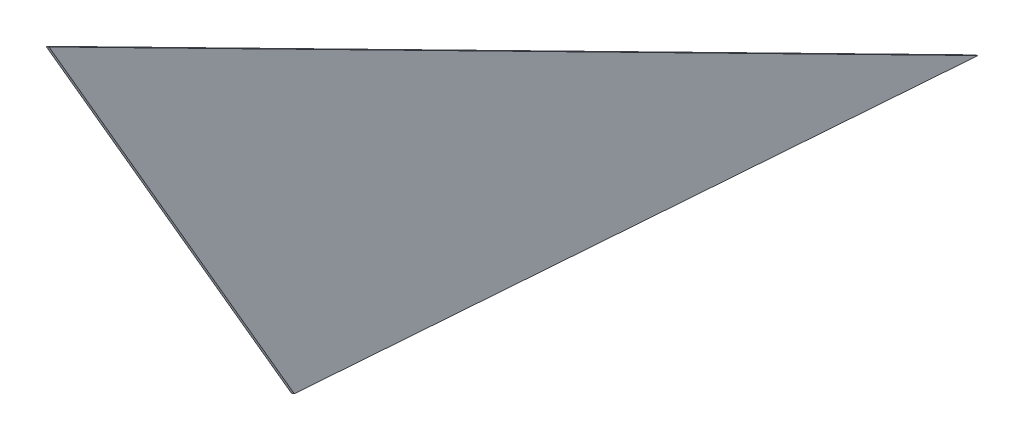
ISO-10303-21;
HEADER;
FILE_DESCRIPTION(('STEP AP214'),'2;1');
FILE_NAME('part.step','',(''),(''),'','','');
FILE_SCHEMA(('AUTOMOTIVE_DESIGN { 1 0 10303 214 1 1 1 1 }'));
ENDSEC;
DATA;
#1=APPLICATION_CONTEXT('core data for automotive mechanical design processes');
#2=APPLICATION_PROTOCOL_DEFINITION('international standard','automotive_design',2000,#1);
#3=PRODUCT_CONTEXT('',#1,'mechanical');
#4=PRODUCT('Part','Part','',(#3));
#5=PRODUCT_RELATED_PRODUCT_CATEGORY('part','',(#4));
#6=PRODUCT_DEFINITION_FORMATION('','',#4);
#7=PRODUCT_DEFINITION_CONTEXT('part definition',#1,'design');
#8=PRODUCT_DEFINITION('design','',#6,#7);
#9=PRODUCT_DEFINITION_SHAPE('','',#8);
#10=(LENGTH_UNIT() NAMED_UNIT(*) SI_UNIT(.MILLI.,.METRE.));
#11=(NAMED_UNIT(*) PLANE_ANGLE_UNIT() SI_UNIT($,.RADIAN.));
#12=(NAMED_UNIT(*) SI_UNIT($,.STERADIAN.) SOLID_ANGLE_UNIT());
#13=UNCERTAINTY_MEASURE_WITH_UNIT(LENGTH_MEASURE(1.E-05),#10,'distance_accuracy_value','');
#14=(GEOMETRIC_REPRESENTATION_CONTEXT(3) GLOBAL_UNCERTAINTY_ASSIGNED_CONTEXT((#13)) GLOBAL_UNIT_ASSIGNED_CONTEXT((#10,
#11,#12)) REPRESENTATION_CONTEXT('',''));
#15=CARTESIAN_POINT('',(0.,0.,0.));
#16=DIRECTION('',(0.,0.,1.));
#17=DIRECTION('',(1.,0.,0.));
#18=AXIS2_PLACEMENT_3D('',#15,#16,#17);
#19=CARTESIAN_POINT('',(85.915008535736,-1.05705600196886,-0.230398713045607));
#20=DIRECTION('',(-0.331944919964192,0.942951182655276,-0.0256054142513217));
#21=DIRECTION('',(-0.943260451694758,-0.332053791227569,0.));
#22=AXIS2_PLACEMENT_3D('',#19,#20,#21);
#23=PLANE('',#22);
#24=DIRECTION('',(-0.0769515262254698,-1.5036026028188E-05,0.997034835091276));
#25=VECTOR('',#24,1.);
#26=CARTESIAN_POINT('',(88.9,0.,0.));
#27=LINE('',#26,#25);
#28=CARTESIAN_POINT('',(133.762595688612,0.00876597501769244,-581.269441792522));
#29=VERTEX_POINT('',#28);
#30=CARTESIAN_POINT('',(88.9,0.,0.));
#31=VERTEX_POINT('',#30);
#32=EDGE_CURVE('E86',#29,#31,#27,.T.);
#33=ORIENTED_EDGE('',*,*,#32,.T.);
#34=DIRECTION('',(0.940154791894152,0.33293102424216,0.0725665237938917));
#35=VECTOR('',#34,1.);
#36=CARTESIAN_POINT('',(85.915008535736,-1.05705600196886,-0.230398713045607));
#37=LINE('',#36,#35);
#38=CARTESIAN_POINT('',(85.915008535736,-1.05705600196886,-0.230398713045607));
#39=VERTEX_POINT('',#38);
#40=EDGE_CURVE('E11',#39,#31,#37,.T.);
#41=ORIENTED_EDGE('',*,*,#40,.F.);
#42=DIRECTION('',(-0.0769515262254698,-1.5036026028188E-05,0.997034835091276));
#43=VECTOR('',#42,1.);
#44=CARTESIAN_POINT('',(85.915008535736,-1.05705600196886,-0.230398713045607));
#45=LINE('',#44,#43);
#46=CARTESIAN_POINT('',(130.777604224348,-1.04829002695117,-581.499840505568));
#47=VERTEX_POINT('',#46);
#48=EDGE_CURVE('E79',#47,#39,#45,.T.);
#49=ORIENTED_EDGE('',*,*,#48,.F.);
#50=DIRECTION('',(0.940154791894152,0.33293102424216,0.0725665237938917));
#51=VECTOR('',#50,1.);
#52=CARTESIAN_POINT('',(130.777604224348,-1.04829002695117,-581.499840505568));
#53=LINE('',#52,#51);
#54=EDGE_CURVE('E87',#47,#29,#53,.T.);
#55=ORIENTED_EDGE('',*,*,#54,.T.);
#56=EDGE_LOOP('',(#33,#41,#49,#55));
#57=FACE_BOUND('',#56,.T.);
#58=ADVANCED_FACE('F39',(#57),#23,.F.);
#59=CARTESIAN_POINT('',(-22.034991464264,278.342943998031,116.473298376921));
#60=DIRECTION('',(-0.0577960685472009,0.365683601297066,-0.928943011278354));
#61=DIRECTION('',(0.,0.930498423022017,0.36629589781151));
#62=AXIS2_PLACEMENT_3D('',#59,#60,#61);
#63=PLANE('',#62);
#64=DIRECTION('',(-0.335810335962059,0.869156163666504,0.363041294375137));
#65=VECTOR('',#64,1.);
#66=CARTESIAN_POINT('',(-19.0500000000001,279.4,116.703697089967));
#67=LINE('',#66,#65);
#68=CARTESIAN_POINT('',(-19.0500000000001,279.4,116.703697089967));
#69=VERTEX_POINT('',#68);
#70=EDGE_CURVE('E67',#31,#69,#67,.T.);
#71=ORIENTED_EDGE('',*,*,#70,.T.);
#72=DIRECTION('',(0.940154791894152,0.33293102424216,0.0725665237938917));
#73=VECTOR('',#72,1.);
#74=CARTESIAN_POINT('',(-22.034991464264,278.342943998031,116.473298376921));
#75=LINE('',#74,#73);
#76=CARTESIAN_POINT('',(-22.034991464264,278.342943998031,116.473298376921));
#77=VERTEX_POINT('',#76);
#78=EDGE_CURVE('E47',#77,#69,#75,.T.);
#79=ORIENTED_EDGE('',*,*,#78,.F.);
#80=DIRECTION('',(-0.335810335962059,0.869156163666504,0.363041294375137));
#81=VECTOR('',#80,1.);
#82=CARTESIAN_POINT('',(-22.034991464264,278.342943998031,116.473298376921));
#83=LINE('',#82,#81);
#84=EDGE_CURVE('E75',#39,#77,#83,.T.);
#85=ORIENTED_EDGE('',*,*,#84,.F.);
#86=ORIENTED_EDGE('',*,*,#40,.T.);
#87=EDGE_LOOP('',(#71,#79,#85,#86));
#88=FACE_BOUND('',#87,.T.);
#89=ADVANCED_FACE('F76',(#88),#63,.F.);
#90=CARTESIAN_POINT('',(130.777604224348,-1.04829002695117,-581.499840505568));
#91=DIRECTION('',(0.276467333447863,-0.869789076090454,0.408696435817517));
#92=DIRECTION('',(0.,-0.425272133456791,-0.905065529398347));
#93=AXIS2_PLACEMENT_3D('',#90,#91,#92);
#94=PLANE('',#93);
#95=DIRECTION('',(0.199185292666631,-0.364175639233021,-0.909780920317924));
#96=VECTOR('',#95,1.);
#97=CARTESIAN_POINT('',(133.762595688612,0.00876597501769244,-581.269441792522));
#98=LINE('',#97,#96);
#99=EDGE_CURVE('E72',#69,#29,#98,.T.);
#100=ORIENTED_EDGE('',*,*,#99,.T.);
#101=ORIENTED_EDGE('',*,*,#54,.F.);
#102=DIRECTION('',(0.199185292666631,-0.364175639233021,-0.909780920317924));
#103=VECTOR('',#102,1.);
#104=CARTESIAN_POINT('',(130.777604224348,-1.04829002695117,-581.499840505568));
#105=LINE('',#104,#103);
#106=EDGE_CURVE('E55',#77,#47,#105,.T.);
#107=ORIENTED_EDGE('',*,*,#106,.F.);
#108=ORIENTED_EDGE('',*,*,#78,.T.);
#109=EDGE_LOOP('',(#100,#101,#107,#108));
#110=FACE_BOUND('',#109,.T.);
#111=ADVANCED_FACE('F94',(#110),#94,.F.);
#112=CARTESIAN_POINT('',(75.5929213446807,26.7692394334731,5.83469400220442));
#113=DIRECTION('',(-0.940154791894152,-0.33293102424216,-0.0725665237938918));
#114=DIRECTION('',(0.333811092337417,-0.942639992060861,0.));
#115=AXIS2_PLACEMENT_3D('',#112,#113,#114);
#116=PLANE('',#115);
#117=ORIENTED_EDGE('',*,*,#48,.T.);
#118=ORIENTED_EDGE('',*,*,#84,.T.);
#119=ORIENTED_EDGE('',*,*,#106,.T.);
#120=EDGE_LOOP('',(#117,#118,#119));
#121=FACE_BOUND('',#120,.T.);
#122=ADVANCED_FACE('F82',(#121),#116,.T.);
#123=CARTESIAN_POINT('',(78.5779128089446,27.8262954354419,6.06509271525003));
#124=DIRECTION('',(-0.940154791894152,-0.33293102424216,-0.0725665237938918));
#125=DIRECTION('',(0.333811092337417,-0.942639992060861,0.));
#126=AXIS2_PLACEMENT_3D('',#123,#124,#125);
#127=PLANE('',#126);
#128=ORIENTED_EDGE('',*,*,#32,.F.);
#129=ORIENTED_EDGE('',*,*,#99,.F.);
#130=ORIENTED_EDGE('',*,*,#70,.F.);
#131=EDGE_LOOP('',(#128,#129,#130));
#132=FACE_BOUND('',#131,.T.);
#133=ADVANCED_FACE('F95',(#132),#127,.F.);
#134=CLOSED_SHELL('',(#58,#89,#111,#122,#133));
#135=MANIFOLD_SOLID_BREP('B2',#134);
#136=ADVANCED_BREP_SHAPE_REPRESENTATION('',(#18,#135),#14);
#137=SHAPE_DEFINITION_REPRESENTATION(#9,#136);
ENDSEC;
END-ISO-10303-21;
